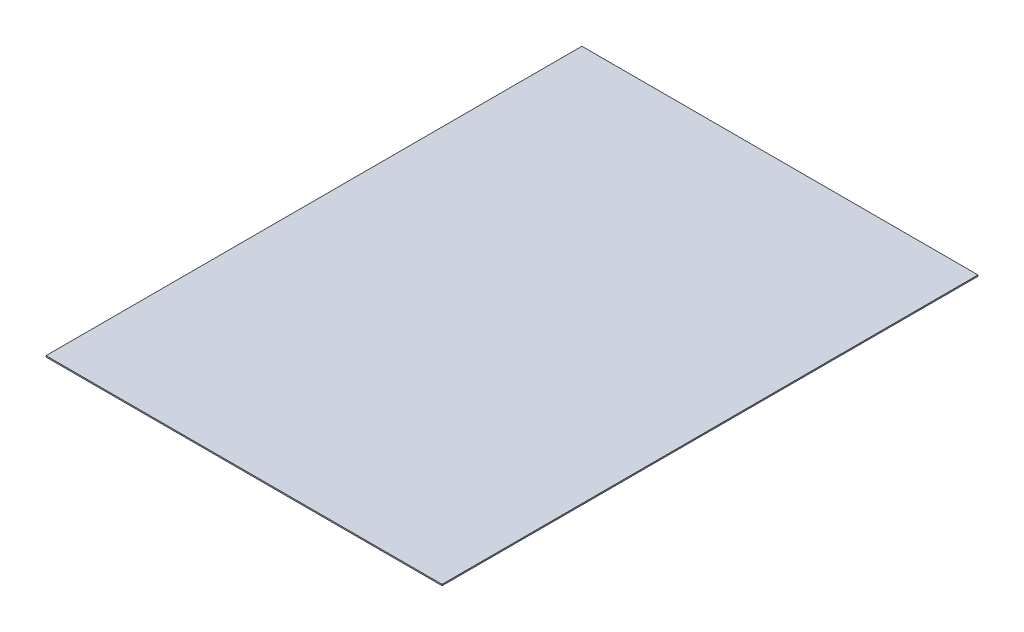
ISO-10303-21;
HEADER;
FILE_DESCRIPTION(('STEP AP214'),'2;1');
FILE_NAME('part.step','',(''),(''),'','','');
FILE_SCHEMA(('AUTOMOTIVE_DESIGN { 1 0 10303 214 1 1 1 1 }'));
ENDSEC;
DATA;
#1=APPLICATION_CONTEXT('core data for automotive mechanical design processes');
#2=APPLICATION_PROTOCOL_DEFINITION('international standard','automotive_design',2000,#1);
#3=PRODUCT_CONTEXT('',#1,'mechanical');
#4=PRODUCT('Part','Part','',(#3));
#5=PRODUCT_RELATED_PRODUCT_CATEGORY('part','',(#4));
#6=PRODUCT_DEFINITION_FORMATION('','',#4);
#7=PRODUCT_DEFINITION_CONTEXT('part definition',#1,'design');
#8=PRODUCT_DEFINITION('design','',#6,#7);
#9=PRODUCT_DEFINITION_SHAPE('','',#8);
#10=(LENGTH_UNIT() NAMED_UNIT(*) SI_UNIT(.MILLI.,.METRE.));
#11=(NAMED_UNIT(*) PLANE_ANGLE_UNIT() SI_UNIT($,.RADIAN.));
#12=(NAMED_UNIT(*) SI_UNIT($,.STERADIAN.) SOLID_ANGLE_UNIT());
#13=UNCERTAINTY_MEASURE_WITH_UNIT(LENGTH_MEASURE(1.E-05),#10,'distance_accuracy_value','');
#14=(GEOMETRIC_REPRESENTATION_CONTEXT(3) GLOBAL_UNCERTAINTY_ASSIGNED_CONTEXT((#13)) GLOBAL_UNIT_ASSIGNED_CONTEXT((#10,
#11,#12)) REPRESENTATION_CONTEXT('',''));
#15=CARTESIAN_POINT('',(0.,0.,0.));
#16=DIRECTION('',(0.,0.,1.));
#17=DIRECTION('',(1.,0.,0.));
#18=AXIS2_PLACEMENT_3D('',#15,#16,#17);
#19=CARTESIAN_POINT('',(0.,0.,0.));
#20=DIRECTION('',(0.,1.,0.));
#21=DIRECTION('',(0.,0.,1.));
#22=AXIS2_PLACEMENT_3D('',#19,#20,#21);
#23=PLANE('',#22);
#24=DIRECTION('',(0.,0.,-1.));
#25=VECTOR('',#24,1.);
#26=CARTESIAN_POINT('',(85.,0.,-115.));
#27=LINE('',#26,#25);
#28=CARTESIAN_POINT('',(85.,0.,115.));
#29=VERTEX_POINT('',#28);
#30=CARTESIAN_POINT('',(85.,0.,-115.));
#31=VERTEX_POINT('',#30);
#32=EDGE_CURVE('E91',#29,#31,#27,.T.);
#33=ORIENTED_EDGE('',*,*,#32,.F.);
#34=DIRECTION('',(1.,0.,0.));
#35=VECTOR('',#34,1.);
#36=CARTESIAN_POINT('',(-85.,0.,115.));
#37=LINE('',#36,#35);
#38=CARTESIAN_POINT('',(-85.,0.,115.));
#39=VERTEX_POINT('',#38);
#40=EDGE_CURVE('E102',#39,#29,#37,.T.);
#41=ORIENTED_EDGE('',*,*,#40,.F.);
#42=DIRECTION('',(0.,0.,1.));
#43=VECTOR('',#42,1.);
#44=CARTESIAN_POINT('',(-85.,0.,-115.));
#45=LINE('',#44,#43);
#46=CARTESIAN_POINT('',(-85.,0.,-115.));
#47=VERTEX_POINT('',#46);
#48=EDGE_CURVE('E93',#47,#39,#45,.T.);
#49=ORIENTED_EDGE('',*,*,#48,.F.);
#50=DIRECTION('',(-1.,0.,0.));
#51=VECTOR('',#50,1.);
#52=CARTESIAN_POINT('',(-85.,0.,-115.));
#53=LINE('',#52,#51);
#54=EDGE_CURVE('E83',#31,#47,#53,.T.);
#55=ORIENTED_EDGE('',*,*,#54,.F.);
#56=EDGE_LOOP('',(#33,#41,#49,#55));
#57=FACE_BOUND('',#56,.T.);
#58=ADVANCED_FACE('F41',(#57),#23,.F.);
#59=CARTESIAN_POINT('',(-85.,286.541992921502,115.));
#60=DIRECTION('',(0.,0.,-1.));
#61=DIRECTION('',(-1.,0.,0.));
#62=AXIS2_PLACEMENT_3D('',#59,#60,#61);
#63=PLANE('',#62);
#64=DIRECTION('',(0.,-1.,0.));
#65=VECTOR('',#64,1.);
#66=CARTESIAN_POINT('',(85.,286.541992921502,115.));
#67=LINE('',#66,#65);
#68=CARTESIAN_POINT('',(85.,0.535000000000008,115.));
#69=VERTEX_POINT('',#68);
#70=EDGE_CURVE('E96',#69,#29,#67,.T.);
#71=ORIENTED_EDGE('',*,*,#70,.F.);
#72=DIRECTION('',(-1.,0.,0.));
#73=VECTOR('',#72,1.);
#74=CARTESIAN_POINT('',(-85.,0.535000000000008,115.));
#75=LINE('',#74,#73);
#76=CARTESIAN_POINT('',(-85.,0.535000000000008,115.));
#77=VERTEX_POINT('',#76);
#78=EDGE_CURVE('E45',#69,#77,#75,.T.);
#79=ORIENTED_EDGE('',*,*,#78,.T.);
#80=DIRECTION('',(0.,-1.,0.));
#81=VECTOR('',#80,1.);
#82=CARTESIAN_POINT('',(-85.,286.541992921502,115.));
#83=LINE('',#82,#81);
#84=EDGE_CURVE('E105',#77,#39,#83,.T.);
#85=ORIENTED_EDGE('',*,*,#84,.T.);
#86=ORIENTED_EDGE('',*,*,#40,.T.);
#87=EDGE_LOOP('',(#71,#79,#85,#86));
#88=FACE_BOUND('',#87,.T.);
#89=ADVANCED_FACE('F114',(#88),#63,.F.);
#90=CARTESIAN_POINT('',(-85.,286.541992921502,-115.));
#91=DIRECTION('',(1.,0.,0.));
#92=DIRECTION('',(0.,0.,-1.));
#93=AXIS2_PLACEMENT_3D('',#90,#91,#92);
#94=PLANE('',#93);
#95=ORIENTED_EDGE('',*,*,#84,.F.);
#96=DIRECTION('',(0.,0.,-1.));
#97=VECTOR('',#96,1.);
#98=CARTESIAN_POINT('',(-85.,0.535000000000008,-115.));
#99=LINE('',#98,#97);
#100=CARTESIAN_POINT('',(-85.,0.535000000000008,-115.));
#101=VERTEX_POINT('',#100);
#102=EDGE_CURVE('E111',#77,#101,#99,.T.);
#103=ORIENTED_EDGE('',*,*,#102,.T.);
#104=DIRECTION('',(0.,-1.,0.));
#105=VECTOR('',#104,1.);
#106=CARTESIAN_POINT('',(-85.,286.541992921502,-115.));
#107=LINE('',#106,#105);
#108=EDGE_CURVE('E87',#101,#47,#107,.T.);
#109=ORIENTED_EDGE('',*,*,#108,.T.);
#110=ORIENTED_EDGE('',*,*,#48,.T.);
#111=EDGE_LOOP('',(#95,#103,#109,#110));
#112=FACE_BOUND('',#111,.T.);
#113=ADVANCED_FACE('F110',(#112),#94,.F.);
#114=CARTESIAN_POINT('',(-85.,286.541992921502,-115.));
#115=DIRECTION('',(0.,0.,1.));
#116=DIRECTION('',(1.,0.,0.));
#117=AXIS2_PLACEMENT_3D('',#114,#115,#116);
#118=PLANE('',#117);
#119=ORIENTED_EDGE('',*,*,#108,.F.);
#120=DIRECTION('',(1.,0.,0.));
#121=VECTOR('',#120,1.);
#122=CARTESIAN_POINT('',(-85.,0.535000000000008,-115.));
#123=LINE('',#122,#121);
#124=CARTESIAN_POINT('',(85.,0.535000000000008,-115.));
#125=VERTEX_POINT('',#124);
#126=EDGE_CURVE('E50',#101,#125,#123,.T.);
#127=ORIENTED_EDGE('',*,*,#126,.T.);
#128=DIRECTION('',(0.,-1.,0.));
#129=VECTOR('',#128,1.);
#130=CARTESIAN_POINT('',(85.,286.541992921502,-115.));
#131=LINE('',#130,#129);
#132=EDGE_CURVE('E80',#125,#31,#131,.T.);
#133=ORIENTED_EDGE('',*,*,#132,.T.);
#134=ORIENTED_EDGE('',*,*,#54,.T.);
#135=EDGE_LOOP('',(#119,#127,#133,#134));
#136=FACE_BOUND('',#135,.T.);
#137=ADVANCED_FACE('F82',(#136),#118,.F.);
#138=CARTESIAN_POINT('',(85.,286.541992921502,-115.));
#139=DIRECTION('',(-1.,0.,0.));
#140=DIRECTION('',(0.,0.,1.));
#141=AXIS2_PLACEMENT_3D('',#138,#139,#140);
#142=PLANE('',#141);
#143=ORIENTED_EDGE('',*,*,#132,.F.);
#144=DIRECTION('',(0.,0.,1.));
#145=VECTOR('',#144,1.);
#146=CARTESIAN_POINT('',(85.,0.535000000000008,-115.));
#147=LINE('',#146,#145);
#148=EDGE_CURVE('E11',#125,#69,#147,.T.);
#149=ORIENTED_EDGE('',*,*,#148,.T.);
#150=ORIENTED_EDGE('',*,*,#70,.T.);
#151=ORIENTED_EDGE('',*,*,#32,.T.);
#152=EDGE_LOOP('',(#143,#149,#150,#151));
#153=FACE_BOUND('',#152,.T.);
#154=ADVANCED_FACE('F43',(#153),#142,.F.);
#155=CARTESIAN_POINT('',(-78.5969321806946,0.534999999999994,-141.657124125128));
#156=DIRECTION('',(0.,-1.,0.));
#157=DIRECTION('',(0.,0.,-1.));
#158=AXIS2_PLACEMENT_3D('',#155,#156,#157);
#159=PLANE('',#158);
#160=ORIENTED_EDGE('',*,*,#126,.F.);
#161=ORIENTED_EDGE('',*,*,#102,.F.);
#162=ORIENTED_EDGE('',*,*,#78,.F.);
#163=ORIENTED_EDGE('',*,*,#148,.F.);
#164=EDGE_LOOP('',(#160,#161,#162,#163));
#165=FACE_BOUND('',#164,.T.);
#166=ADVANCED_FACE('F128',(#165),#159,.F.);
#167=CLOSED_SHELL('',(#58,#89,#113,#137,#154,#166));
#168=MANIFOLD_SOLID_BREP('B2',#167);
#169=ADVANCED_BREP_SHAPE_REPRESENTATION('',(#18,#168),#14);
#170=SHAPE_DEFINITION_REPRESENTATION(#9,#169);
ENDSEC;
END-ISO-10303-21;
